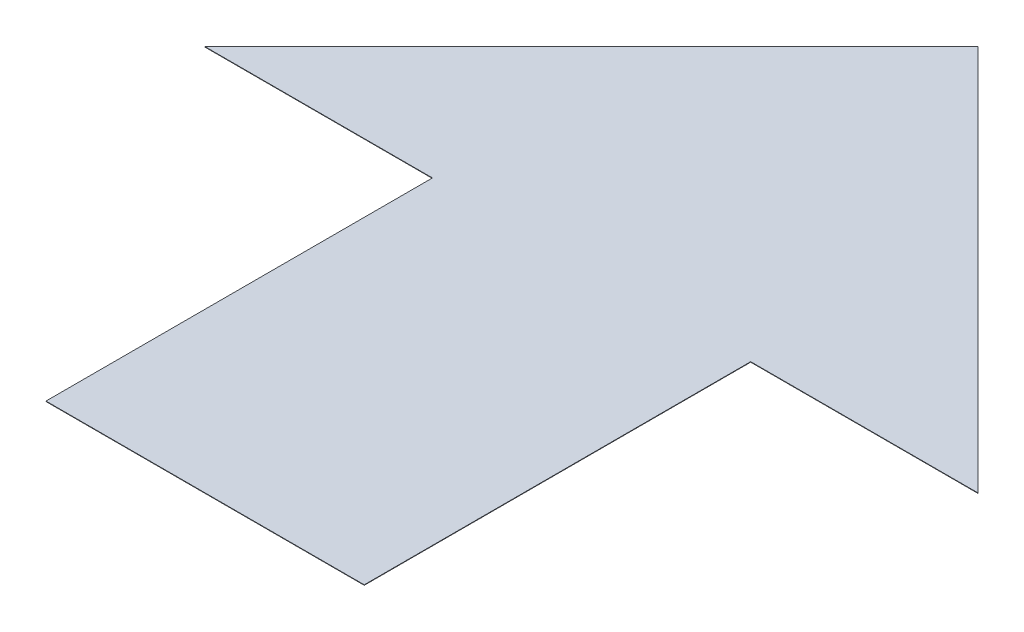
ISO-10303-21;
HEADER;
FILE_DESCRIPTION(('STEP AP214'),'2;1');
FILE_NAME('part.step','',(''),(''),'','','');
FILE_SCHEMA(('AUTOMOTIVE_DESIGN { 1 0 10303 214 1 1 1 1 }'));
ENDSEC;
DATA;
#1=APPLICATION_CONTEXT('core data for automotive mechanical design processes');
#2=APPLICATION_PROTOCOL_DEFINITION('international standard','automotive_design',2000,#1);
#3=PRODUCT_CONTEXT('',#1,'mechanical');
#4=PRODUCT('Part','Part','',(#3));
#5=PRODUCT_RELATED_PRODUCT_CATEGORY('part','',(#4));
#6=PRODUCT_DEFINITION_FORMATION('','',#4);
#7=PRODUCT_DEFINITION_CONTEXT('part definition',#1,'design');
#8=PRODUCT_DEFINITION('design','',#6,#7);
#9=PRODUCT_DEFINITION_SHAPE('','',#8);
#10=(LENGTH_UNIT() NAMED_UNIT(*) SI_UNIT(.MILLI.,.METRE.));
#11=(NAMED_UNIT(*) PLANE_ANGLE_UNIT() SI_UNIT($,.RADIAN.));
#12=(NAMED_UNIT(*) SI_UNIT($,.STERADIAN.) SOLID_ANGLE_UNIT());
#13=UNCERTAINTY_MEASURE_WITH_UNIT(LENGTH_MEASURE(1.E-05),#10,'distance_accuracy_value','');
#14=(GEOMETRIC_REPRESENTATION_CONTEXT(3) GLOBAL_UNCERTAINTY_ASSIGNED_CONTEXT((#13)) GLOBAL_UNIT_ASSIGNED_CONTEXT((#10,
#11,#12)) REPRESENTATION_CONTEXT('',''));
#15=CARTESIAN_POINT('',(0.,0.,0.));
#16=DIRECTION('',(0.,0.,1.));
#17=DIRECTION('',(1.,0.,0.));
#18=AXIS2_PLACEMENT_3D('',#15,#16,#17);
#19=CARTESIAN_POINT('',(35.,0.05,3.53453863373852E-13));
#20=DIRECTION('',(0.,0.,-1.));
#21=DIRECTION('',(-1.,0.,0.));
#22=AXIS2_PLACEMENT_3D('',#19,#20,#21);
#23=PLANE('',#22);
#24=DIRECTION('',(1.,0.,0.));
#25=VECTOR('',#24,1.);
#26=CARTESIAN_POINT('',(35.,-0.05,3.53453863373852E-13));
#27=LINE('',#26,#25);
#28=CARTESIAN_POINT('',(35.,-0.05,3.53453863373852E-13));
#29=VERTEX_POINT('',#28);
#30=CARTESIAN_POINT('',(85.,-0.05,3.1311527354003E-13));
#31=VERTEX_POINT('',#30);
#32=EDGE_CURVE('E126',#29,#31,#27,.T.);
#33=ORIENTED_EDGE('',*,*,#32,.T.);
#34=DIRECTION('',(0.,-1.,0.));
#35=VECTOR('',#34,1.);
#36=CARTESIAN_POINT('',(85.,0.05,3.1311527354003E-13));
#37=LINE('',#36,#35);
#38=CARTESIAN_POINT('',(85.,0.05,3.1311527354003E-13));
#39=VERTEX_POINT('',#38);
#40=EDGE_CURVE('E11',#39,#31,#37,.T.);
#41=ORIENTED_EDGE('',*,*,#40,.F.);
#42=DIRECTION('',(1.,0.,0.));
#43=VECTOR('',#42,1.);
#44=CARTESIAN_POINT('',(35.,0.05,3.53453863373852E-13));
#45=LINE('',#44,#43);
#46=CARTESIAN_POINT('',(35.,0.05,3.53453863373852E-13));
#47=VERTEX_POINT('',#46);
#48=EDGE_CURVE('E138',#47,#39,#45,.T.);
#49=ORIENTED_EDGE('',*,*,#48,.F.);
#50=DIRECTION('',(0.,-1.,0.));
#51=VECTOR('',#50,1.);
#52=CARTESIAN_POINT('',(35.,0.05,3.53453863373852E-13));
#53=LINE('',#52,#51);
#54=EDGE_CURVE('E122',#47,#29,#53,.T.);
#55=ORIENTED_EDGE('',*,*,#54,.T.);
#56=EDGE_LOOP('',(#33,#41,#49,#55));
#57=FACE_BOUND('',#56,.T.);
#58=ADVANCED_FACE('F36',(#57),#23,.F.);
#59=CARTESIAN_POINT('',(85.,0.05,3.1311527354003E-13));
#60=DIRECTION('',(-0.707106781186549,0.,0.707106781186546));
#61=DIRECTION('',(0.707106781186546,0.,0.707106781186549));
#62=AXIS2_PLACEMENT_3D('',#59,#60,#61);
#63=PLANE('',#62);
#64=DIRECTION('',(-0.707106781186546,0.,-0.707106781186549));
#65=VECTOR('',#64,1.);
#66=CARTESIAN_POINT('',(85.,-0.05,3.1311527354003E-13));
#67=LINE('',#66,#65);
#68=CARTESIAN_POINT('',(0.,-0.05,-85.));
#69=VERTEX_POINT('',#68);
#70=EDGE_CURVE('E129',#31,#69,#67,.T.);
#71=ORIENTED_EDGE('',*,*,#70,.T.);
#72=DIRECTION('',(0.,-1.,0.));
#73=VECTOR('',#72,1.);
#74=CARTESIAN_POINT('',(0.,0.05,-85.));
#75=LINE('',#74,#73);
#76=CARTESIAN_POINT('',(0.,0.05,-85.));
#77=VERTEX_POINT('',#76);
#78=EDGE_CURVE('E44',#77,#69,#75,.T.);
#79=ORIENTED_EDGE('',*,*,#78,.F.);
#80=DIRECTION('',(-0.707106781186546,0.,-0.707106781186549));
#81=VECTOR('',#80,1.);
#82=CARTESIAN_POINT('',(85.,0.05,3.1311527354003E-13));
#83=LINE('',#82,#81);
#84=EDGE_CURVE('E92',#39,#77,#83,.T.);
#85=ORIENTED_EDGE('',*,*,#84,.F.);
#86=ORIENTED_EDGE('',*,*,#40,.T.);
#87=EDGE_LOOP('',(#71,#79,#85,#86));
#88=FACE_BOUND('',#87,.T.);
#89=ADVANCED_FACE('F163',(#88),#63,.F.);
#90=CARTESIAN_POINT('',(-85.,0.05,3.68149624963621E-13));
#91=DIRECTION('',(0.707106781186549,0.,0.707106781186546));
#92=DIRECTION('',(0.707106781186546,0.,-0.707106781186549));
#93=AXIS2_PLACEMENT_3D('',#90,#91,#92);
#94=PLANE('',#93);
#95=DIRECTION('',(-0.707106781186546,0.,0.707106781186549));
#96=VECTOR('',#95,1.);
#97=CARTESIAN_POINT('',(-85.,-0.05,3.68149624963621E-13));
#98=LINE('',#97,#96);
#99=CARTESIAN_POINT('',(-85.,-0.05,3.68149624963621E-13));
#100=VERTEX_POINT('',#99);
#101=EDGE_CURVE('E131',#69,#100,#98,.T.);
#102=ORIENTED_EDGE('',*,*,#101,.T.);
#103=DIRECTION('',(0.,-1.,0.));
#104=VECTOR('',#103,1.);
#105=CARTESIAN_POINT('',(-85.,0.05,3.68149624963621E-13));
#106=LINE('',#105,#104);
#107=CARTESIAN_POINT('',(-85.,0.05,3.68149624963621E-13));
#108=VERTEX_POINT('',#107);
#109=EDGE_CURVE('E142',#108,#100,#106,.T.);
#110=ORIENTED_EDGE('',*,*,#109,.F.);
#111=DIRECTION('',(-0.707106781186546,0.,0.707106781186549));
#112=VECTOR('',#111,1.);
#113=CARTESIAN_POINT('',(-85.,0.05,3.68149624963621E-13));
#114=LINE('',#113,#112);
#115=EDGE_CURVE('E150',#77,#108,#114,.T.);
#116=ORIENTED_EDGE('',*,*,#115,.F.);
#117=ORIENTED_EDGE('',*,*,#78,.T.);
#118=EDGE_LOOP('',(#102,#110,#116,#117));
#119=FACE_BOUND('',#118,.T.);
#120=ADVANCED_FACE('F148',(#119),#94,.F.);
#121=CARTESIAN_POINT('',(-35.,0.05,3.62026390967884E-13));
#122=DIRECTION('',(0.,0.,-1.));
#123=DIRECTION('',(-1.,0.,0.));
#124=AXIS2_PLACEMENT_3D('',#121,#122,#123);
#125=PLANE('',#124);
#126=DIRECTION('',(1.,0.,0.));
#127=VECTOR('',#126,1.);
#128=CARTESIAN_POINT('',(-35.,-0.05,3.62026390967884E-13));
#129=LINE('',#128,#127);
#130=CARTESIAN_POINT('',(-35.,-0.05,3.62026390967884E-13));
#131=VERTEX_POINT('',#130);
#132=EDGE_CURVE('E133',#100,#131,#129,.T.);
#133=ORIENTED_EDGE('',*,*,#132,.T.);
#134=DIRECTION('',(0.,-1.,0.));
#135=VECTOR('',#134,1.);
#136=CARTESIAN_POINT('',(-35.,0.05,3.62026390967884E-13));
#137=LINE('',#136,#135);
#138=CARTESIAN_POINT('',(-35.,0.05,3.62026390967884E-13));
#139=VERTEX_POINT('',#138);
#140=EDGE_CURVE('E117',#139,#131,#137,.T.);
#141=ORIENTED_EDGE('',*,*,#140,.F.);
#142=DIRECTION('',(1.,0.,0.));
#143=VECTOR('',#142,1.);
#144=CARTESIAN_POINT('',(-35.,0.05,3.62026390967884E-13));
#145=LINE('',#144,#143);
#146=EDGE_CURVE('E108',#108,#139,#145,.T.);
#147=ORIENTED_EDGE('',*,*,#146,.F.);
#148=ORIENTED_EDGE('',*,*,#109,.T.);
#149=EDGE_LOOP('',(#133,#141,#147,#148));
#150=FACE_BOUND('',#149,.T.);
#151=ADVANCED_FACE('F156',(#150),#125,.F.);
#152=CARTESIAN_POINT('',(-35.,0.05,85.));
#153=DIRECTION('',(1.,0.,0.));
#154=DIRECTION('',(0.,0.,-1.));
#155=AXIS2_PLACEMENT_3D('',#152,#153,#154);
#156=PLANE('',#155);
#157=DIRECTION('',(0.,0.,1.));
#158=VECTOR('',#157,1.);
#159=CARTESIAN_POINT('',(-35.,-0.05,85.));
#160=LINE('',#159,#158);
#161=CARTESIAN_POINT('',(-35.,-0.05,85.));
#162=VERTEX_POINT('',#161);
#163=EDGE_CURVE('E116',#131,#162,#160,.T.);
#164=ORIENTED_EDGE('',*,*,#163,.T.);
#165=DIRECTION('',(0.,-1.,0.));
#166=VECTOR('',#165,1.);
#167=CARTESIAN_POINT('',(-35.,0.05,85.));
#168=LINE('',#167,#166);
#169=CARTESIAN_POINT('',(-35.,0.05,85.));
#170=VERTEX_POINT('',#169);
#171=EDGE_CURVE('E113',#170,#162,#168,.T.);
#172=ORIENTED_EDGE('',*,*,#171,.F.);
#173=DIRECTION('',(0.,0.,1.));
#174=VECTOR('',#173,1.);
#175=CARTESIAN_POINT('',(-35.,0.05,85.));
#176=LINE('',#175,#174);
#177=EDGE_CURVE('E102',#139,#170,#176,.T.);
#178=ORIENTED_EDGE('',*,*,#177,.F.);
#179=ORIENTED_EDGE('',*,*,#140,.T.);
#180=EDGE_LOOP('',(#164,#172,#178,#179));
#181=FACE_BOUND('',#180,.T.);
#182=ADVANCED_FACE('F114',(#181),#156,.F.);
#183=CARTESIAN_POINT('',(35.,0.05,85.));
#184=DIRECTION('',(0.,0.,-1.));
#185=DIRECTION('',(-1.,0.,0.));
#186=AXIS2_PLACEMENT_3D('',#183,#184,#185);
#187=PLANE('',#186);
#188=DIRECTION('',(1.,0.,0.));
#189=VECTOR('',#188,1.);
#190=CARTESIAN_POINT('',(35.,-0.05,85.));
#191=LINE('',#190,#189);
#192=CARTESIAN_POINT('',(35.,-0.05,85.));
#193=VERTEX_POINT('',#192);
#194=EDGE_CURVE('E78',#162,#193,#191,.T.);
#195=ORIENTED_EDGE('',*,*,#194,.T.);
#196=DIRECTION('',(0.,-1.,0.));
#197=VECTOR('',#196,1.);
#198=CARTESIAN_POINT('',(35.,0.05,85.));
#199=LINE('',#198,#197);
#200=CARTESIAN_POINT('',(35.,0.05,85.));
#201=VERTEX_POINT('',#200);
#202=EDGE_CURVE('E118',#201,#193,#199,.T.);
#203=ORIENTED_EDGE('',*,*,#202,.F.);
#204=DIRECTION('',(1.,0.,0.));
#205=VECTOR('',#204,1.);
#206=CARTESIAN_POINT('',(35.,0.05,85.));
#207=LINE('',#206,#205);
#208=EDGE_CURVE('E106',#170,#201,#207,.T.);
#209=ORIENTED_EDGE('',*,*,#208,.F.);
#210=ORIENTED_EDGE('',*,*,#171,.T.);
#211=EDGE_LOOP('',(#195,#203,#209,#210));
#212=FACE_BOUND('',#211,.T.);
#213=ADVANCED_FACE('F120',(#212),#187,.F.);
#214=CARTESIAN_POINT('',(35.,0.05,85.));
#215=DIRECTION('',(-1.,0.,0.));
#216=DIRECTION('',(0.,0.,1.));
#217=AXIS2_PLACEMENT_3D('',#214,#215,#216);
#218=PLANE('',#217);
#219=DIRECTION('',(0.,0.,-1.));
#220=VECTOR('',#219,1.);
#221=CARTESIAN_POINT('',(35.,-0.05,85.));
#222=LINE('',#221,#220);
#223=EDGE_CURVE('E84',#193,#29,#222,.T.);
#224=ORIENTED_EDGE('',*,*,#223,.T.);
#225=ORIENTED_EDGE('',*,*,#54,.F.);
#226=DIRECTION('',(0.,0.,-1.));
#227=VECTOR('',#226,1.);
#228=CARTESIAN_POINT('',(35.,0.05,85.));
#229=LINE('',#228,#227);
#230=EDGE_CURVE('E52',#201,#47,#229,.T.);
#231=ORIENTED_EDGE('',*,*,#230,.F.);
#232=ORIENTED_EDGE('',*,*,#202,.T.);
#233=EDGE_LOOP('',(#224,#225,#231,#232));
#234=FACE_BOUND('',#233,.T.);
#235=ADVANCED_FACE('F177',(#234),#218,.F.);
#236=CARTESIAN_POINT('',(0.,0.05,0.));
#237=DIRECTION('',(0.,1.,0.));
#238=DIRECTION('',(0.,0.,1.));
#239=AXIS2_PLACEMENT_3D('',#236,#237,#238);
#240=PLANE('',#239);
#241=ORIENTED_EDGE('',*,*,#48,.T.);
#242=ORIENTED_EDGE('',*,*,#84,.T.);
#243=ORIENTED_EDGE('',*,*,#115,.T.);
#244=ORIENTED_EDGE('',*,*,#146,.T.);
#245=ORIENTED_EDGE('',*,*,#177,.T.);
#246=ORIENTED_EDGE('',*,*,#208,.T.);
#247=ORIENTED_EDGE('',*,*,#230,.T.);
#248=EDGE_LOOP('',(#241,#242,#243,#244,#245,#246,#247));
#249=FACE_BOUND('',#248,.T.);
#250=ADVANCED_FACE('F104',(#249),#240,.T.);
#251=CARTESIAN_POINT('',(0.,-0.05,0.));
#252=DIRECTION('',(0.,1.,0.));
#253=DIRECTION('',(0.,0.,1.));
#254=AXIS2_PLACEMENT_3D('',#251,#252,#253);
#255=PLANE('',#254);
#256=ORIENTED_EDGE('',*,*,#32,.F.);
#257=ORIENTED_EDGE('',*,*,#223,.F.);
#258=ORIENTED_EDGE('',*,*,#194,.F.);
#259=ORIENTED_EDGE('',*,*,#163,.F.);
#260=ORIENTED_EDGE('',*,*,#132,.F.);
#261=ORIENTED_EDGE('',*,*,#101,.F.);
#262=ORIENTED_EDGE('',*,*,#70,.F.);
#263=EDGE_LOOP('',(#256,#257,#258,#259,#260,#261,#262));
#264=FACE_BOUND('',#263,.T.);
#265=ADVANCED_FACE('F154',(#264),#255,.F.);
#266=CLOSED_SHELL('',(#58,#89,#120,#151,#182,#213,#235,#250,#265));
#267=MANIFOLD_SOLID_BREP('B2',#266);
#268=ADVANCED_BREP_SHAPE_REPRESENTATION('',(#18,#267),#14);
#269=SHAPE_DEFINITION_REPRESENTATION(#9,#268);
ENDSEC;
END-ISO-10303-21;
